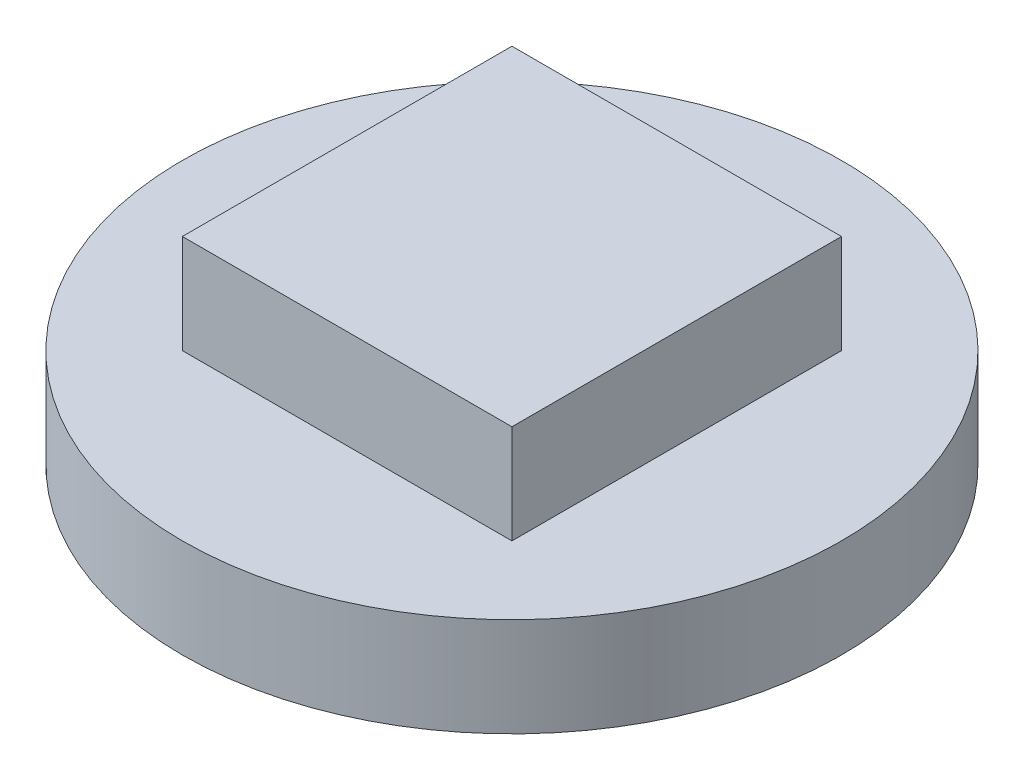
ISO-10303-21;
HEADER;
FILE_DESCRIPTION(('STEP AP214'),'2;1');
FILE_NAME('part.step','',(''),(''),'','','');
FILE_SCHEMA(('AUTOMOTIVE_DESIGN { 1 0 10303 214 1 1 1 1 }'));
ENDSEC;
DATA;
#1=APPLICATION_CONTEXT('core data for automotive mechanical design processes');
#2=APPLICATION_PROTOCOL_DEFINITION('international standard','automotive_design',2000,#1);
#3=PRODUCT_CONTEXT('',#1,'mechanical');
#4=PRODUCT('Part','Part','',(#3));
#5=PRODUCT_RELATED_PRODUCT_CATEGORY('part','',(#4));
#6=PRODUCT_DEFINITION_FORMATION('','',#4);
#7=PRODUCT_DEFINITION_CONTEXT('part definition',#1,'design');
#8=PRODUCT_DEFINITION('design','',#6,#7);
#9=PRODUCT_DEFINITION_SHAPE('','',#8);
#10=(LENGTH_UNIT() NAMED_UNIT(*) SI_UNIT(.MILLI.,.METRE.));
#11=(NAMED_UNIT(*) PLANE_ANGLE_UNIT() SI_UNIT($,.RADIAN.));
#12=(NAMED_UNIT(*) SI_UNIT($,.STERADIAN.) SOLID_ANGLE_UNIT());
#13=UNCERTAINTY_MEASURE_WITH_UNIT(LENGTH_MEASURE(1.E-05),#10,'distance_accuracy_value','');
#14=(GEOMETRIC_REPRESENTATION_CONTEXT(3) GLOBAL_UNCERTAINTY_ASSIGNED_CONTEXT((#13)) GLOBAL_UNIT_ASSIGNED_CONTEXT((#10,
#11,#12)) REPRESENTATION_CONTEXT('',''));
#15=CARTESIAN_POINT('',(0.,0.,0.));
#16=DIRECTION('',(0.,0.,1.));
#17=DIRECTION('',(1.,0.,0.));
#18=AXIS2_PLACEMENT_3D('',#15,#16,#17);
#19=CARTESIAN_POINT('',(0.,1.5,0.));
#20=DIRECTION('',(0.,1.,0.));
#21=DIRECTION('',(0.,0.,1.));
#22=AXIS2_PLACEMENT_3D('',#19,#20,#21);
#23=PLANE('',#22);
#24=CARTESIAN_POINT('',(0.,1.5,0.));
#25=DIRECTION('',(0.,1.,0.));
#26=DIRECTION('',(0.,0.,1.));
#27=AXIS2_PLACEMENT_3D('',#24,#25,#26);
#28=CIRCLE('',#27,5.);
#29=CARTESIAN_POINT('',(0.,1.5,5.));
#30=VERTEX_POINT('',#29);
#31=EDGE_CURVE('E11',#30,#30,#28,.T.);
#32=ORIENTED_EDGE('',*,*,#31,.T.);
#33=EDGE_LOOP('',(#32));
#34=FACE_BOUND('',#33,.T.);
#35=DIRECTION('',(-1.,0.,0.));
#36=VECTOR('',#35,1.);
#37=CARTESIAN_POINT('',(0.,1.5,2.5));
#38=LINE('',#37,#36);
#39=CARTESIAN_POINT('',(2.5,1.5,2.5));
#40=VERTEX_POINT('',#39);
#41=CARTESIAN_POINT('',(-2.5,1.5,2.5));
#42=VERTEX_POINT('',#41);
#43=EDGE_CURVE('E107',#40,#42,#38,.T.);
#44=ORIENTED_EDGE('',*,*,#43,.T.);
#45=DIRECTION('',(0.,0.,-1.));
#46=VECTOR('',#45,1.);
#47=CARTESIAN_POINT('',(-2.5,1.5,0.));
#48=LINE('',#47,#46);
#49=CARTESIAN_POINT('',(-2.5,1.5,-2.5));
#50=VERTEX_POINT('',#49);
#51=EDGE_CURVE('E59',#42,#50,#48,.T.);
#52=ORIENTED_EDGE('',*,*,#51,.T.);
#53=DIRECTION('',(1.,0.,0.));
#54=VECTOR('',#53,1.);
#55=CARTESIAN_POINT('',(0.,1.5,-2.5));
#56=LINE('',#55,#54);
#57=CARTESIAN_POINT('',(2.5,1.5,-2.5));
#58=VERTEX_POINT('',#57);
#59=EDGE_CURVE('E97',#50,#58,#56,.T.);
#60=ORIENTED_EDGE('',*,*,#59,.T.);
#61=DIRECTION('',(0.,0.,1.));
#62=VECTOR('',#61,1.);
#63=CARTESIAN_POINT('',(2.5,1.5,0.));
#64=LINE('',#63,#62);
#65=EDGE_CURVE('E100',#58,#40,#64,.T.);
#66=ORIENTED_EDGE('',*,*,#65,.T.);
#67=EDGE_LOOP('',(#44,#52,#60,#66));
#68=FACE_BOUND('',#67,.T.);
#69=ADVANCED_FACE('F36',(#34,#68),#23,.T.);
#70=CARTESIAN_POINT('',(0.,1.5,0.));
#71=DIRECTION('',(0.,-1.,0.));
#72=DIRECTION('',(0.,0.,-1.));
#73=AXIS2_PLACEMENT_3D('',#70,#71,#72);
#74=CYLINDRICAL_SURFACE('',#73,5.);
#75=ORIENTED_EDGE('',*,*,#31,.F.);
#76=EDGE_LOOP('',(#75));
#77=FACE_BOUND('',#76,.T.);
#78=CARTESIAN_POINT('',(0.,0.,0.));
#79=DIRECTION('',(0.,1.,0.));
#80=DIRECTION('',(0.,0.,1.));
#81=AXIS2_PLACEMENT_3D('',#78,#79,#80);
#82=CIRCLE('',#81,5.);
#83=CARTESIAN_POINT('',(0.,0.,5.));
#84=VERTEX_POINT('',#83);
#85=EDGE_CURVE('E40',#84,#84,#82,.T.);
#86=ORIENTED_EDGE('',*,*,#85,.T.);
#87=EDGE_LOOP('',(#86));
#88=FACE_BOUND('',#87,.T.);
#89=ADVANCED_FACE('F38',(#77,#88),#74,.T.);
#90=CARTESIAN_POINT('',(0.,0.,0.));
#91=DIRECTION('',(0.,1.,0.));
#92=DIRECTION('',(0.,0.,1.));
#93=AXIS2_PLACEMENT_3D('',#90,#91,#92);
#94=PLANE('',#93);
#95=ORIENTED_EDGE('',*,*,#85,.F.);
#96=EDGE_LOOP('',(#95));
#97=FACE_BOUND('',#96,.T.);
#98=ADVANCED_FACE('F114',(#97),#94,.F.);
#99=CARTESIAN_POINT('',(-2.5,3.,-2.5));
#100=DIRECTION('',(1.,0.,0.));
#101=DIRECTION('',(0.,0.,-1.));
#102=AXIS2_PLACEMENT_3D('',#99,#100,#101);
#103=PLANE('',#102);
#104=ORIENTED_EDGE('',*,*,#51,.F.);
#105=DIRECTION('',(0.,-1.,0.));
#106=VECTOR('',#105,1.);
#107=CARTESIAN_POINT('',(-2.5,3.,2.5));
#108=LINE('',#107,#106);
#109=CARTESIAN_POINT('',(-2.5,3.,2.5));
#110=VERTEX_POINT('',#109);
#111=EDGE_CURVE('E82',#110,#42,#108,.T.);
#112=ORIENTED_EDGE('',*,*,#111,.F.);
#113=DIRECTION('',(0.,0.,1.));
#114=VECTOR('',#113,1.);
#115=CARTESIAN_POINT('',(-2.5,3.,-2.5));
#116=LINE('',#115,#114);
#117=CARTESIAN_POINT('',(-2.5,3.,-2.5));
#118=VERTEX_POINT('',#117);
#119=EDGE_CURVE('E89',#118,#110,#116,.T.);
#120=ORIENTED_EDGE('',*,*,#119,.F.);
#121=DIRECTION('',(0.,-1.,0.));
#122=VECTOR('',#121,1.);
#123=CARTESIAN_POINT('',(-2.5,3.,-2.5));
#124=LINE('',#123,#122);
#125=EDGE_CURVE('E182',#118,#50,#124,.T.);
#126=ORIENTED_EDGE('',*,*,#125,.T.);
#127=EDGE_LOOP('',(#104,#112,#120,#126));
#128=FACE_BOUND('',#127,.T.);
#129=ADVANCED_FACE('F96',(#128),#103,.F.);
#130=CARTESIAN_POINT('',(-2.5,3.,2.5));
#131=DIRECTION('',(0.,0.,-1.));
#132=DIRECTION('',(-1.,0.,0.));
#133=AXIS2_PLACEMENT_3D('',#130,#131,#132);
#134=PLANE('',#133);
#135=ORIENTED_EDGE('',*,*,#43,.F.);
#136=DIRECTION('',(0.,-1.,0.));
#137=VECTOR('',#136,1.);
#138=CARTESIAN_POINT('',(2.5,3.,2.5));
#139=LINE('',#138,#137);
#140=CARTESIAN_POINT('',(2.5,3.,2.5));
#141=VERTEX_POINT('',#140);
#142=EDGE_CURVE('E85',#141,#40,#139,.T.);
#143=ORIENTED_EDGE('',*,*,#142,.F.);
#144=DIRECTION('',(1.,0.,0.));
#145=VECTOR('',#144,1.);
#146=CARTESIAN_POINT('',(-2.5,3.,2.5));
#147=LINE('',#146,#145);
#148=EDGE_CURVE('E79',#110,#141,#147,.T.);
#149=ORIENTED_EDGE('',*,*,#148,.F.);
#150=ORIENTED_EDGE('',*,*,#111,.T.);
#151=EDGE_LOOP('',(#135,#143,#149,#150));
#152=FACE_BOUND('',#151,.T.);
#153=ADVANCED_FACE('F81',(#152),#134,.F.);
#154=CARTESIAN_POINT('',(2.5,3.,-2.5));
#155=DIRECTION('',(-1.,0.,0.));
#156=DIRECTION('',(0.,0.,1.));
#157=AXIS2_PLACEMENT_3D('',#154,#155,#156);
#158=PLANE('',#157);
#159=ORIENTED_EDGE('',*,*,#65,.F.);
#160=DIRECTION('',(0.,-1.,0.));
#161=VECTOR('',#160,1.);
#162=CARTESIAN_POINT('',(2.5,3.,-2.5));
#163=LINE('',#162,#161);
#164=CARTESIAN_POINT('',(2.5,3.,-2.5));
#165=VERTEX_POINT('',#164);
#166=EDGE_CURVE('E51',#165,#58,#163,.T.);
#167=ORIENTED_EDGE('',*,*,#166,.F.);
#168=DIRECTION('',(0.,0.,-1.));
#169=VECTOR('',#168,1.);
#170=CARTESIAN_POINT('',(2.5,3.,-2.5));
#171=LINE('',#170,#169);
#172=EDGE_CURVE('E88',#141,#165,#171,.T.);
#173=ORIENTED_EDGE('',*,*,#172,.F.);
#174=ORIENTED_EDGE('',*,*,#142,.T.);
#175=EDGE_LOOP('',(#159,#167,#173,#174));
#176=FACE_BOUND('',#175,.T.);
#177=ADVANCED_FACE('F130',(#176),#158,.F.);
#178=CARTESIAN_POINT('',(-2.5,3.,-2.5));
#179=DIRECTION('',(0.,0.,1.));
#180=DIRECTION('',(1.,0.,0.));
#181=AXIS2_PLACEMENT_3D('',#178,#179,#180);
#182=PLANE('',#181);
#183=ORIENTED_EDGE('',*,*,#59,.F.);
#184=ORIENTED_EDGE('',*,*,#125,.F.);
#185=DIRECTION('',(-1.,0.,0.));
#186=VECTOR('',#185,1.);
#187=CARTESIAN_POINT('',(-2.5,3.,-2.5));
#188=LINE('',#187,#186);
#189=EDGE_CURVE('E93',#165,#118,#188,.T.);
#190=ORIENTED_EDGE('',*,*,#189,.F.);
#191=ORIENTED_EDGE('',*,*,#166,.T.);
#192=EDGE_LOOP('',(#183,#184,#190,#191));
#193=FACE_BOUND('',#192,.T.);
#194=ADVANCED_FACE('F133',(#193),#182,.F.);
#195=CARTESIAN_POINT('',(0.,3.,0.));
#196=DIRECTION('',(0.,1.,0.));
#197=DIRECTION('',(0.,0.,1.));
#198=AXIS2_PLACEMENT_3D('',#195,#196,#197);
#199=PLANE('',#198);
#200=ORIENTED_EDGE('',*,*,#119,.T.);
#201=ORIENTED_EDGE('',*,*,#148,.T.);
#202=ORIENTED_EDGE('',*,*,#172,.T.);
#203=ORIENTED_EDGE('',*,*,#189,.T.);
#204=EDGE_LOOP('',(#200,#201,#202,#203));
#205=FACE_BOUND('',#204,.T.);
#206=ADVANCED_FACE('F92',(#205),#199,.T.);
#207=CLOSED_SHELL('',(#69,#89,#98,#129,#153,#177,#194,#206));
#208=MANIFOLD_SOLID_BREP('B2',#207);
#209=ADVANCED_BREP_SHAPE_REPRESENTATION('',(#18,#208),#14);
#210=SHAPE_DEFINITION_REPRESENTATION(#9,#209);
ENDSEC;
END-ISO-10303-21;
